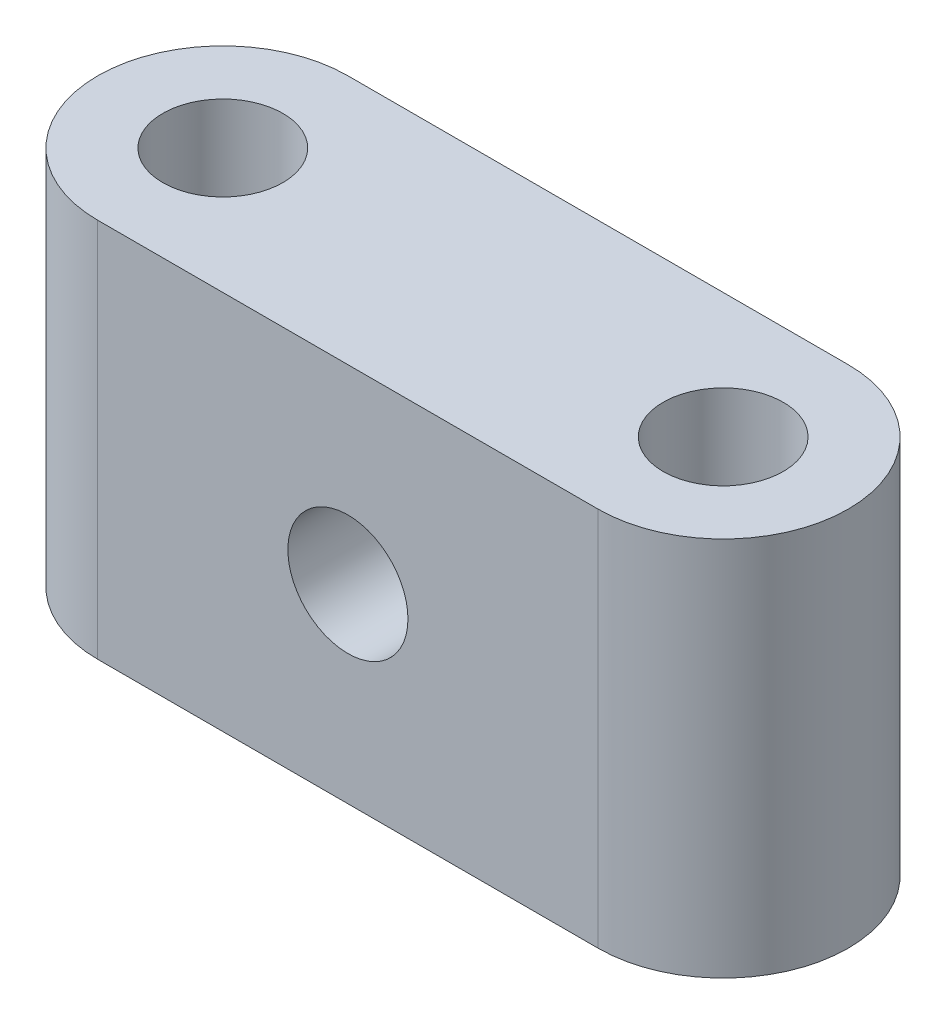
ISO-10303-21;
HEADER;
FILE_DESCRIPTION(('STEP AP214'),'2;1');
FILE_NAME('part.step','',(''),(''),'','','');
FILE_SCHEMA(('AUTOMOTIVE_DESIGN { 1 0 10303 214 1 1 1 1 }'));
ENDSEC;
DATA;
#1=APPLICATION_CONTEXT('core data for automotive mechanical design processes');
#2=APPLICATION_PROTOCOL_DEFINITION('international standard','automotive_design',2000,#1);
#3=PRODUCT_CONTEXT('',#1,'mechanical');
#4=PRODUCT('Part','Part','',(#3));
#5=PRODUCT_RELATED_PRODUCT_CATEGORY('part','',(#4));
#6=PRODUCT_DEFINITION_FORMATION('','',#4);
#7=PRODUCT_DEFINITION_CONTEXT('part definition',#1,'design');
#8=PRODUCT_DEFINITION('design','',#6,#7);
#9=PRODUCT_DEFINITION_SHAPE('','',#8);
#10=(LENGTH_UNIT() NAMED_UNIT(*) SI_UNIT(.MILLI.,.METRE.));
#11=(NAMED_UNIT(*) PLANE_ANGLE_UNIT() SI_UNIT($,.RADIAN.));
#12=(NAMED_UNIT(*) SI_UNIT($,.STERADIAN.) SOLID_ANGLE_UNIT());
#13=UNCERTAINTY_MEASURE_WITH_UNIT(LENGTH_MEASURE(1.E-05),#10,'distance_accuracy_value','');
#14=(GEOMETRIC_REPRESENTATION_CONTEXT(3) GLOBAL_UNCERTAINTY_ASSIGNED_CONTEXT((#13)) GLOBAL_UNIT_ASSIGNED_CONTEXT((#10,
#11,#12)) REPRESENTATION_CONTEXT('',''));
#15=CARTESIAN_POINT('',(0.,0.,0.));
#16=DIRECTION('',(0.,0.,1.));
#17=DIRECTION('',(1.,0.,0.));
#18=AXIS2_PLACEMENT_3D('',#15,#16,#17);
#19=CARTESIAN_POINT('',(0.,38.,0.));
#20=DIRECTION('',(0.,1.,0.));
#21=DIRECTION('',(0.,0.,1.));
#22=AXIS2_PLACEMENT_3D('',#19,#20,#21);
#23=PLANE('',#22);
#24=CARTESIAN_POINT('',(0.,38.,0.));
#25=DIRECTION('',(0.,1.,0.));
#26=DIRECTION('',(0.,0.,1.));
#27=AXIS2_PLACEMENT_3D('',#24,#25,#26);
#28=CIRCLE('',#27,6.);
#29=CARTESIAN_POINT('',(0.,38.,6.));
#30=VERTEX_POINT('',#29);
#31=EDGE_CURVE('E112',#30,#30,#28,.T.);
#32=ORIENTED_EDGE('',*,*,#31,.F.);
#33=EDGE_LOOP('',(#32));
#34=FACE_BOUND('',#33,.T.);
#35=CARTESIAN_POINT('',(0.,38.,0.));
#36=DIRECTION('',(0.,1.,0.));
#37=DIRECTION('',(0.,0.,1.));
#38=AXIS2_PLACEMENT_3D('',#35,#36,#37);
#39=CIRCLE('',#38,12.5);
#40=CARTESIAN_POINT('',(0.,38.,-12.5));
#41=VERTEX_POINT('',#40);
#42=CARTESIAN_POINT('',(0.,38.,12.5));
#43=VERTEX_POINT('',#42);
#44=EDGE_CURVE('E92',#41,#43,#39,.T.);
#45=ORIENTED_EDGE('',*,*,#44,.T.);
#46=DIRECTION('',(1.,0.,0.));
#47=VECTOR('',#46,1.);
#48=CARTESIAN_POINT('',(0.,38.,12.5));
#49=LINE('',#48,#47);
#50=CARTESIAN_POINT('',(50.,38.,12.5));
#51=VERTEX_POINT('',#50);
#52=EDGE_CURVE('E87',#43,#51,#49,.T.);
#53=ORIENTED_EDGE('',*,*,#52,.T.);
#54=CARTESIAN_POINT('',(50.,38.,0.));
#55=DIRECTION('',(0.,1.,0.));
#56=DIRECTION('',(0.,0.,1.));
#57=AXIS2_PLACEMENT_3D('',#54,#55,#56);
#58=CIRCLE('',#57,12.5);
#59=CARTESIAN_POINT('',(50.,38.,-12.5));
#60=VERTEX_POINT('',#59);
#61=EDGE_CURVE('E90',#51,#60,#58,.T.);
#62=ORIENTED_EDGE('',*,*,#61,.T.);
#63=DIRECTION('',(-1.,0.,0.));
#64=VECTOR('',#63,1.);
#65=CARTESIAN_POINT('',(0.,38.,-12.5));
#66=LINE('',#65,#64);
#67=EDGE_CURVE('E57',#60,#41,#66,.T.);
#68=ORIENTED_EDGE('',*,*,#67,.T.);
#69=EDGE_LOOP('',(#45,#53,#62,#68));
#70=FACE_BOUND('',#69,.T.);
#71=CARTESIAN_POINT('',(50.,38.,0.));
#72=DIRECTION('',(0.,1.,0.));
#73=DIRECTION('',(0.,0.,1.));
#74=AXIS2_PLACEMENT_3D('',#71,#72,#73);
#75=CIRCLE('',#74,6.);
#76=CARTESIAN_POINT('',(50.,38.,6.));
#77=VERTEX_POINT('',#76);
#78=EDGE_CURVE('E134',#77,#77,#75,.T.);
#79=ORIENTED_EDGE('',*,*,#78,.F.);
#80=EDGE_LOOP('',(#79));
#81=FACE_BOUND('',#80,.T.);
#82=ADVANCED_FACE('F39',(#34,#70,#81),#23,.T.);
#83=CARTESIAN_POINT('',(0.,0.,0.));
#84=DIRECTION('',(0.,1.,0.));
#85=DIRECTION('',(0.,0.,1.));
#86=AXIS2_PLACEMENT_3D('',#83,#84,#85);
#87=PLANE('',#86);
#88=CARTESIAN_POINT('',(0.,0.,0.));
#89=DIRECTION('',(0.,1.,0.));
#90=DIRECTION('',(0.,0.,1.));
#91=AXIS2_PLACEMENT_3D('',#88,#89,#90);
#92=CIRCLE('',#91,12.5);
#93=CARTESIAN_POINT('',(0.,0.,-12.5));
#94=VERTEX_POINT('',#93);
#95=CARTESIAN_POINT('',(0.,0.,12.5));
#96=VERTEX_POINT('',#95);
#97=EDGE_CURVE('E108',#94,#96,#92,.T.);
#98=ORIENTED_EDGE('',*,*,#97,.F.);
#99=DIRECTION('',(-1.,0.,0.));
#100=VECTOR('',#99,1.);
#101=CARTESIAN_POINT('',(0.,0.,-12.5));
#102=LINE('',#101,#100);
#103=CARTESIAN_POINT('',(50.,0.,-12.5));
#104=VERTEX_POINT('',#103);
#105=EDGE_CURVE('E80',#104,#94,#102,.T.);
#106=ORIENTED_EDGE('',*,*,#105,.F.);
#107=CARTESIAN_POINT('',(50.,0.,0.));
#108=DIRECTION('',(0.,1.,0.));
#109=DIRECTION('',(0.,0.,1.));
#110=AXIS2_PLACEMENT_3D('',#107,#108,#109);
#111=CIRCLE('',#110,12.5);
#112=CARTESIAN_POINT('',(50.,0.,12.5));
#113=VERTEX_POINT('',#112);
#114=EDGE_CURVE('E74',#113,#104,#111,.T.);
#115=ORIENTED_EDGE('',*,*,#114,.F.);
#116=DIRECTION('',(1.,0.,0.));
#117=VECTOR('',#116,1.);
#118=CARTESIAN_POINT('',(0.,0.,12.5));
#119=LINE('',#118,#117);
#120=EDGE_CURVE('E97',#96,#113,#119,.T.);
#121=ORIENTED_EDGE('',*,*,#120,.F.);
#122=EDGE_LOOP('',(#98,#106,#115,#121));
#123=FACE_BOUND('',#122,.T.);
#124=CARTESIAN_POINT('',(0.,0.,0.));
#125=DIRECTION('',(0.,1.,0.));
#126=DIRECTION('',(0.,0.,1.));
#127=AXIS2_PLACEMENT_3D('',#124,#125,#126);
#128=CIRCLE('',#127,6.);
#129=CARTESIAN_POINT('',(0.,0.,6.));
#130=VERTEX_POINT('',#129);
#131=EDGE_CURVE('E130',#130,#130,#128,.T.);
#132=ORIENTED_EDGE('',*,*,#131,.T.);
#133=EDGE_LOOP('',(#132));
#134=FACE_BOUND('',#133,.T.);
#135=CARTESIAN_POINT('',(50.,0.,0.));
#136=DIRECTION('',(0.,1.,0.));
#137=DIRECTION('',(0.,0.,1.));
#138=AXIS2_PLACEMENT_3D('',#135,#136,#137);
#139=CIRCLE('',#138,6.);
#140=CARTESIAN_POINT('',(50.,0.,6.));
#141=VERTEX_POINT('',#140);
#142=EDGE_CURVE('E138',#141,#141,#139,.T.);
#143=ORIENTED_EDGE('',*,*,#142,.T.);
#144=EDGE_LOOP('',(#143));
#145=FACE_BOUND('',#144,.T.);
#146=ADVANCED_FACE('F125',(#123,#134,#145),#87,.F.);
#147=CARTESIAN_POINT('',(0.,38.,0.));
#148=DIRECTION('',(0.,-1.,0.));
#149=DIRECTION('',(0.,0.,-1.));
#150=AXIS2_PLACEMENT_3D('',#147,#148,#149);
#151=CYLINDRICAL_SURFACE('',#150,12.5);
#152=ORIENTED_EDGE('',*,*,#97,.T.);
#153=DIRECTION('',(0.,-1.,0.));
#154=VECTOR('',#153,1.);
#155=CARTESIAN_POINT('',(0.,38.,12.5));
#156=LINE('',#155,#154);
#157=EDGE_CURVE('E11',#43,#96,#156,.T.);
#158=ORIENTED_EDGE('',*,*,#157,.F.);
#159=ORIENTED_EDGE('',*,*,#44,.F.);
#160=DIRECTION('',(0.,-1.,0.));
#161=VECTOR('',#160,1.);
#162=CARTESIAN_POINT('',(0.,38.,-12.5));
#163=LINE('',#162,#161);
#164=EDGE_CURVE('E104',#41,#94,#163,.T.);
#165=ORIENTED_EDGE('',*,*,#164,.T.);
#166=EDGE_LOOP('',(#152,#158,#159,#165));
#167=FACE_BOUND('',#166,.T.);
#168=ADVANCED_FACE('F41',(#167),#151,.T.);
#169=CARTESIAN_POINT('',(0.,38.,12.5));
#170=DIRECTION('',(0.,0.,-1.));
#171=DIRECTION('',(-1.,0.,0.));
#172=AXIS2_PLACEMENT_3D('',#169,#170,#171);
#173=PLANE('',#172);
#174=CARTESIAN_POINT('',(25.,19.,12.5));
#175=DIRECTION('',(0.,0.,1.));
#176=DIRECTION('',(1.,0.,0.));
#177=AXIS2_PLACEMENT_3D('',#174,#175,#176);
#178=CIRCLE('',#177,6.);
#179=CARTESIAN_POINT('',(31.,19.,12.5));
#180=VERTEX_POINT('',#179);
#181=EDGE_CURVE('E146',#180,#180,#178,.T.);
#182=ORIENTED_EDGE('',*,*,#181,.F.);
#183=EDGE_LOOP('',(#182));
#184=FACE_BOUND('',#183,.T.);
#185=ORIENTED_EDGE('',*,*,#120,.T.);
#186=DIRECTION('',(0.,-1.,0.));
#187=VECTOR('',#186,1.);
#188=CARTESIAN_POINT('',(50.,38.,12.5));
#189=LINE('',#188,#187);
#190=EDGE_CURVE('E49',#51,#113,#189,.T.);
#191=ORIENTED_EDGE('',*,*,#190,.F.);
#192=ORIENTED_EDGE('',*,*,#52,.F.);
#193=ORIENTED_EDGE('',*,*,#157,.T.);
#194=EDGE_LOOP('',(#185,#191,#192,#193));
#195=FACE_BOUND('',#194,.T.);
#196=ADVANCED_FACE('F96',(#184,#195),#173,.F.);
#197=CARTESIAN_POINT('',(50.,38.,0.));
#198=DIRECTION('',(0.,-1.,0.));
#199=DIRECTION('',(0.,0.,-1.));
#200=AXIS2_PLACEMENT_3D('',#197,#198,#199);
#201=CYLINDRICAL_SURFACE('',#200,12.5);
#202=ORIENTED_EDGE('',*,*,#114,.T.);
#203=DIRECTION('',(0.,-1.,0.));
#204=VECTOR('',#203,1.);
#205=CARTESIAN_POINT('',(50.,38.,-12.5));
#206=LINE('',#205,#204);
#207=EDGE_CURVE('E99',#60,#104,#206,.T.);
#208=ORIENTED_EDGE('',*,*,#207,.F.);
#209=ORIENTED_EDGE('',*,*,#61,.F.);
#210=ORIENTED_EDGE('',*,*,#190,.T.);
#211=EDGE_LOOP('',(#202,#208,#209,#210));
#212=FACE_BOUND('',#211,.T.);
#213=ADVANCED_FACE('F100',(#212),#201,.T.);
#214=CARTESIAN_POINT('',(0.,38.,-12.5));
#215=DIRECTION('',(0.,0.,1.));
#216=DIRECTION('',(1.,0.,0.));
#217=AXIS2_PLACEMENT_3D('',#214,#215,#216);
#218=PLANE('',#217);
#219=ORIENTED_EDGE('',*,*,#105,.T.);
#220=ORIENTED_EDGE('',*,*,#164,.F.);
#221=ORIENTED_EDGE('',*,*,#67,.F.);
#222=ORIENTED_EDGE('',*,*,#207,.T.);
#223=EDGE_LOOP('',(#219,#220,#221,#222));
#224=FACE_BOUND('',#223,.T.);
#225=ADVANCED_FACE('F122',(#224),#218,.F.);
#226=CARTESIAN_POINT('',(0.,38.,0.));
#227=DIRECTION('',(0.,-1.,0.));
#228=DIRECTION('',(0.,0.,-1.));
#229=AXIS2_PLACEMENT_3D('',#226,#227,#228);
#230=CYLINDRICAL_SURFACE('',#229,6.);
#231=ORIENTED_EDGE('',*,*,#31,.T.);
#232=EDGE_LOOP('',(#231));
#233=FACE_BOUND('',#232,.T.);
#234=ORIENTED_EDGE('',*,*,#131,.F.);
#235=EDGE_LOOP('',(#234));
#236=FACE_BOUND('',#235,.T.);
#237=ADVANCED_FACE('F178',(#233,#236),#230,.F.);
#238=CARTESIAN_POINT('',(50.,38.,0.));
#239=DIRECTION('',(0.,-1.,0.));
#240=DIRECTION('',(0.,0.,-1.));
#241=AXIS2_PLACEMENT_3D('',#238,#239,#240);
#242=CYLINDRICAL_SURFACE('',#241,6.);
#243=ORIENTED_EDGE('',*,*,#78,.T.);
#244=EDGE_LOOP('',(#243));
#245=FACE_BOUND('',#244,.T.);
#246=ORIENTED_EDGE('',*,*,#142,.F.);
#247=EDGE_LOOP('',(#246));
#248=FACE_BOUND('',#247,.T.);
#249=ADVANCED_FACE('F159',(#245,#248),#242,.F.);
#250=CARTESIAN_POINT('',(25.,19.,0.));
#251=DIRECTION('',(0.,0.,1.));
#252=DIRECTION('',(1.,0.,0.));
#253=AXIS2_PLACEMENT_3D('',#250,#251,#252);
#254=CYLINDRICAL_SURFACE('',#253,6.);
#255=CARTESIAN_POINT('',(25.,19.,0.));
#256=DIRECTION('',(0.,0.,1.));
#257=DIRECTION('',(1.,0.,0.));
#258=AXIS2_PLACEMENT_3D('',#255,#256,#257);
#259=CIRCLE('',#258,6.);
#260=CARTESIAN_POINT('',(31.,19.,0.));
#261=VERTEX_POINT('',#260);
#262=EDGE_CURVE('E142',#261,#261,#259,.T.);
#263=ORIENTED_EDGE('',*,*,#262,.F.);
#264=EDGE_LOOP('',(#263));
#265=FACE_BOUND('',#264,.T.);
#266=ORIENTED_EDGE('',*,*,#181,.T.);
#267=EDGE_LOOP('',(#266));
#268=FACE_BOUND('',#267,.T.);
#269=ADVANCED_FACE('F156',(#265,#268),#254,.F.);
#270=CARTESIAN_POINT('',(25.,19.,0.));
#271=DIRECTION('',(0.,0.,1.));
#272=DIRECTION('',(1.,0.,0.));
#273=AXIS2_PLACEMENT_3D('',#270,#271,#272);
#274=PLANE('',#273);
#275=ORIENTED_EDGE('',*,*,#262,.T.);
#276=EDGE_LOOP('',(#275));
#277=FACE_BOUND('',#276,.T.);
#278=ADVANCED_FACE('F154',(#277),#274,.T.);
#279=CLOSED_SHELL('',(#82,#146,#168,#196,#213,#225,#237,#249,#269,#278));
#280=MANIFOLD_SOLID_BREP('B2',#279);
#281=ADVANCED_BREP_SHAPE_REPRESENTATION('',(#18,#280),#14);
#282=SHAPE_DEFINITION_REPRESENTATION(#9,#281);
ENDSEC;
END-ISO-10303-21;
